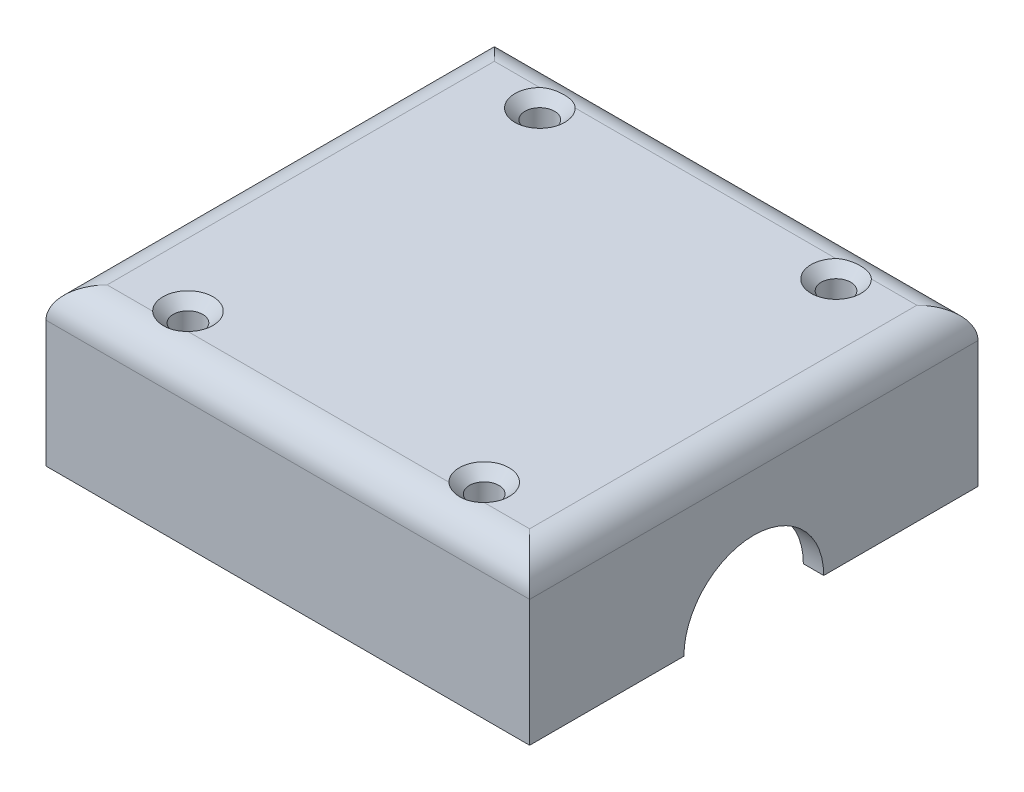
ISO-10303-21;
HEADER;
FILE_DESCRIPTION(('STEP AP214'),'2;1');
FILE_NAME('part.step','',(''),(''),'','','');
FILE_SCHEMA(('AUTOMOTIVE_DESIGN { 1 0 10303 214 1 1 1 1 }'));
ENDSEC;
DATA;
#1=APPLICATION_CONTEXT('core data for automotive mechanical design processes');
#2=APPLICATION_PROTOCOL_DEFINITION('international standard','automotive_design',2000,#1);
#3=PRODUCT_CONTEXT('',#1,'mechanical');
#4=PRODUCT('Part','Part','',(#3));
#5=PRODUCT_RELATED_PRODUCT_CATEGORY('part','',(#4));
#6=PRODUCT_DEFINITION_FORMATION('','',#4);
#7=PRODUCT_DEFINITION_CONTEXT('part definition',#1,'design');
#8=PRODUCT_DEFINITION('design','',#6,#7);
#9=PRODUCT_DEFINITION_SHAPE('','',#8);
#10=(LENGTH_UNIT() NAMED_UNIT(*) SI_UNIT(.MILLI.,.METRE.));
#11=(NAMED_UNIT(*) PLANE_ANGLE_UNIT() SI_UNIT($,.RADIAN.));
#12=(NAMED_UNIT(*) SI_UNIT($,.STERADIAN.) SOLID_ANGLE_UNIT());
#13=UNCERTAINTY_MEASURE_WITH_UNIT(LENGTH_MEASURE(1.E-05),#10,'distance_accuracy_value','');
#14=(GEOMETRIC_REPRESENTATION_CONTEXT(3) GLOBAL_UNCERTAINTY_ASSIGNED_CONTEXT((#13)) GLOBAL_UNIT_ASSIGNED_CONTEXT((#10,
#11,#12)) REPRESENTATION_CONTEXT('',''));
#15=CARTESIAN_POINT('',(0.,0.,0.));
#16=DIRECTION('',(0.,0.,1.));
#17=DIRECTION('',(1.,0.,0.));
#18=AXIS2_PLACEMENT_3D('',#15,#16,#17);
#19=CARTESIAN_POINT('',(0.129999999999996,7.65,-10.1));
#20=DIRECTION('',(0.,0.,-1.));
#21=DIRECTION('',(-1.,0.,0.));
#22=AXIS2_PLACEMENT_3D('',#19,#20,#21);
#23=PLANE('',#22);
#24=DIRECTION('',(-1.,0.,0.));
#25=VECTOR('',#24,1.);
#26=CARTESIAN_POINT('',(0.129999999999998,1.99705277911944,-10.1));
#27=LINE('',#26,#25);
#28=CARTESIAN_POINT('',(0.129999999999996,1.99705277911943,-10.1));
#29=VERTEX_POINT('',#28);
#30=CARTESIAN_POINT('',(-23.73,1.99705277911943,-10.1));
#31=VERTEX_POINT('',#30);
#32=EDGE_CURVE('E51',#29,#31,#27,.T.);
#33=ORIENTED_EDGE('',*,*,#32,.T.);
#34=DIRECTION('',(0.,-1.,0.));
#35=VECTOR('',#34,1.);
#36=CARTESIAN_POINT('',(-23.73,7.65,-10.1));
#37=LINE('',#36,#35);
#38=CARTESIAN_POINT('',(-23.73,0.,-10.1));
#39=VERTEX_POINT('',#38);
#40=EDGE_CURVE('E233',#31,#39,#37,.T.);
#41=ORIENTED_EDGE('',*,*,#40,.T.);
#42=DIRECTION('',(1.,0.,0.));
#43=VECTOR('',#42,1.);
#44=CARTESIAN_POINT('',(0.129999999999996,0.,-10.1));
#45=LINE('',#44,#43);
#46=CARTESIAN_POINT('',(0.129999999999996,0.,-10.1));
#47=VERTEX_POINT('',#46);
#48=EDGE_CURVE('E229',#39,#47,#45,.T.);
#49=ORIENTED_EDGE('',*,*,#48,.T.);
#50=DIRECTION('',(0.,-1.,0.));
#51=VECTOR('',#50,1.);
#52=CARTESIAN_POINT('',(0.129999999999996,7.65,-10.1));
#53=LINE('',#52,#51);
#54=EDGE_CURVE('E56',#29,#47,#53,.T.);
#55=ORIENTED_EDGE('',*,*,#54,.F.);
#56=EDGE_LOOP('',(#33,#41,#49,#55));
#57=FACE_BOUND('',#56,.T.);
#58=ADVANCED_FACE('F35',(#57),#23,.F.);
#59=CARTESIAN_POINT('',(0.,7.65,0.));
#60=DIRECTION('',(0.,-1.,0.));
#61=DIRECTION('',(0.,0.,-1.));
#62=AXIS2_PLACEMENT_3D('',#59,#60,#61);
#63=PLANE('',#62);
#64=DIRECTION('',(0.,0.,-1.));
#65=VECTOR('',#64,1.);
#66=CARTESIAN_POINT('',(-23.73,7.65,-10.1));
#67=LINE('',#66,#65);
#68=CARTESIAN_POINT('',(-23.73,7.65,7.65));
#69=VERTEX_POINT('',#68);
#70=CARTESIAN_POINT('',(-23.73,7.65,-7.65));
#71=VERTEX_POINT('',#70);
#72=EDGE_CURVE('E178',#69,#71,#67,.T.);
#73=ORIENTED_EDGE('',*,*,#72,.T.);
#74=DIRECTION('',(-1.,0.,0.));
#75=VECTOR('',#74,1.);
#76=CARTESIAN_POINT('',(0.129999999999998,7.65,-7.65));
#77=LINE('',#76,#75);
#78=CARTESIAN_POINT('',(0.129999999999996,7.65,-7.65));
#79=VERTEX_POINT('',#78);
#80=EDGE_CURVE('E487',#79,#71,#77,.T.);
#81=ORIENTED_EDGE('',*,*,#80,.F.);
#82=DIRECTION('',(0.,0.,1.));
#83=VECTOR('',#82,1.);
#84=CARTESIAN_POINT('',(0.129999999999996,7.65,-10.1));
#85=LINE('',#84,#83);
#86=CARTESIAN_POINT('',(0.129999999999996,7.65,7.65));
#87=VERTEX_POINT('',#86);
#88=EDGE_CURVE('E187',#79,#87,#85,.T.);
#89=ORIENTED_EDGE('',*,*,#88,.T.);
#90=DIRECTION('',(-1.,0.,0.));
#91=VECTOR('',#90,1.);
#92=CARTESIAN_POINT('',(0.129999999999998,7.65,7.65));
#93=LINE('',#92,#91);
#94=EDGE_CURVE('E191',#87,#69,#93,.T.);
#95=ORIENTED_EDGE('',*,*,#94,.T.);
#96=EDGE_LOOP('',(#73,#81,#89,#95));
#97=FACE_BOUND('',#96,.T.);
#98=ADVANCED_FACE('F192',(#97),#63,.T.);
#99=CARTESIAN_POINT('',(0.,0.,0.));
#100=DIRECTION('',(0.,1.,0.));
#101=DIRECTION('',(0.,0.,1.));
#102=AXIS2_PLACEMENT_3D('',#99,#100,#101);
#103=PLANE('',#102);
#104=CARTESIAN_POINT('',(14.535,0.,17.265));
#105=DIRECTION('',(0.,1.,0.));
#106=DIRECTION('',(0.,0.,1.));
#107=AXIS2_PLACEMENT_3D('',#104,#105,#106);
#108=CIRCLE('',#107,1.45);
#109=CARTESIAN_POINT('',(14.535,0.,18.715));
#110=VERTEX_POINT('',#109);
#111=EDGE_CURVE('E218',#110,#110,#108,.T.);
#112=ORIENTED_EDGE('',*,*,#111,.T.);
#113=EDGE_LOOP('',(#112));
#114=FACE_BOUND('',#113,.T.);
#115=CARTESIAN_POINT('',(-14.535,0.,17.265));
#116=DIRECTION('',(0.,1.,0.));
#117=DIRECTION('',(0.,0.,1.));
#118=AXIS2_PLACEMENT_3D('',#115,#116,#117);
#119=CIRCLE('',#118,1.45);
#120=CARTESIAN_POINT('',(-14.535,0.,18.715));
#121=VERTEX_POINT('',#120);
#122=EDGE_CURVE('E222',#121,#121,#119,.F.);
#123=ORIENTED_EDGE('',*,*,#122,.F.);
#124=EDGE_LOOP('',(#123));
#125=FACE_BOUND('',#124,.T.);
#126=DIRECTION('',(0.,0.,1.));
#127=VECTOR('',#126,1.);
#128=CARTESIAN_POINT('',(21.73,0.,0.));
#129=LINE('',#128,#127);
#130=CARTESIAN_POINT('',(21.73,0.,6.86000000000001));
#131=VERTEX_POINT('',#130);
#132=CARTESIAN_POINT('',(21.73,0.,10.91));
#133=VERTEX_POINT('',#132);
#134=EDGE_CURVE('E254',#131,#133,#129,.T.);
#135=ORIENTED_EDGE('',*,*,#134,.F.);
#136=DIRECTION('',(1.,0.,0.));
#137=VECTOR('',#136,1.);
#138=CARTESIAN_POINT('',(21.55,0.,6.86000000000001));
#139=LINE('',#138,#137);
#140=CARTESIAN_POINT('',(23.73,0.,6.86000000000001));
#141=VERTEX_POINT('',#140);
#142=EDGE_CURVE('E214',#131,#141,#139,.T.);
#143=ORIENTED_EDGE('',*,*,#142,.T.);
#144=DIRECTION('',(0.,0.,-1.));
#145=VECTOR('',#144,1.);
#146=CARTESIAN_POINT('',(23.73,0.,0.));
#147=LINE('',#146,#145);
#148=CARTESIAN_POINT('',(23.73,0.,22.));
#149=VERTEX_POINT('',#148);
#150=EDGE_CURVE('E262',#149,#141,#147,.T.);
#151=ORIENTED_EDGE('',*,*,#150,.F.);
#152=DIRECTION('',(1.,0.,0.));
#153=VECTOR('',#152,1.);
#154=CARTESIAN_POINT('',(0.,0.,22.));
#155=LINE('',#154,#153);
#156=CARTESIAN_POINT('',(-23.73,0.,22.));
#157=VERTEX_POINT('',#156);
#158=EDGE_CURVE('E258',#157,#149,#155,.T.);
#159=ORIENTED_EDGE('',*,*,#158,.F.);
#160=DIRECTION('',(0.,0.,-1.));
#161=VECTOR('',#160,1.);
#162=CARTESIAN_POINT('',(-23.73,0.,0.));
#163=LINE('',#162,#161);
#164=CARTESIAN_POINT('',(-23.73,0.,10.1));
#165=VERTEX_POINT('',#164);
#166=EDGE_CURVE('E269',#157,#165,#163,.T.);
#167=ORIENTED_EDGE('',*,*,#166,.T.);
#168=DIRECTION('',(-1.,0.,0.));
#169=VECTOR('',#168,1.);
#170=CARTESIAN_POINT('',(0.129999999999996,0.,10.1));
#171=LINE('',#170,#169);
#172=CARTESIAN_POINT('',(0.129999999999996,0.,10.1));
#173=VERTEX_POINT('',#172);
#174=EDGE_CURVE('E188',#173,#165,#171,.T.);
#175=ORIENTED_EDGE('',*,*,#174,.F.);
#176=DIRECTION('',(0.,0.,1.));
#177=VECTOR('',#176,1.);
#178=CARTESIAN_POINT('',(0.129999999999996,0.,0.));
#179=LINE('',#178,#177);
#180=CARTESIAN_POINT('',(0.129999999999996,0.,10.91));
#181=VERTEX_POINT('',#180);
#182=EDGE_CURVE('E247',#173,#181,#179,.T.);
#183=ORIENTED_EDGE('',*,*,#182,.T.);
#184=DIRECTION('',(1.,0.,0.));
#185=VECTOR('',#184,1.);
#186=CARTESIAN_POINT('',(0.,0.,10.91));
#187=LINE('',#186,#185);
#188=EDGE_CURVE('E244',#181,#133,#187,.T.);
#189=ORIENTED_EDGE('',*,*,#188,.T.);
#190=EDGE_LOOP('',(#135,#143,#151,#159,#167,#175,#183,#189));
#191=FACE_BOUND('',#190,.T.);
#192=ADVANCED_FACE('F378',(#114,#125,#191),#103,.F.);
#193=CARTESIAN_POINT('',(23.73,0.,-6.85999999999999));
#194=VERTEX_POINT('',#193);
#195=CARTESIAN_POINT('',(23.73,0.,-22.));
#196=VERTEX_POINT('',#195);
#197=EDGE_CURVE('E261',#194,#196,#147,.T.);
#198=ORIENTED_EDGE('',*,*,#197,.F.);
#199=DIRECTION('',(1.,0.,0.));
#200=VECTOR('',#199,1.);
#201=CARTESIAN_POINT('',(21.55,0.,-6.85999999999999));
#202=LINE('',#201,#200);
#203=CARTESIAN_POINT('',(21.73,0.,-6.85999999999999));
#204=VERTEX_POINT('',#203);
#205=EDGE_CURVE('E211',#194,#204,#202,.F.);
#206=ORIENTED_EDGE('',*,*,#205,.T.);
#207=CARTESIAN_POINT('',(21.73,0.,-10.91));
#208=VERTEX_POINT('',#207);
#209=EDGE_CURVE('E255',#208,#204,#129,.T.);
#210=ORIENTED_EDGE('',*,*,#209,.F.);
#211=DIRECTION('',(1.,0.,0.));
#212=VECTOR('',#211,1.);
#213=CARTESIAN_POINT('',(0.,0.,-10.91));
#214=LINE('',#213,#212);
#215=CARTESIAN_POINT('',(0.129999999999996,0.,-10.91));
#216=VERTEX_POINT('',#215);
#217=EDGE_CURVE('E251',#216,#208,#214,.T.);
#218=ORIENTED_EDGE('',*,*,#217,.F.);
#219=EDGE_CURVE('E248',#216,#47,#179,.T.);
#220=ORIENTED_EDGE('',*,*,#219,.T.);
#221=ORIENTED_EDGE('',*,*,#48,.F.);
#222=CARTESIAN_POINT('',(-23.73,0.,-22.));
#223=VERTEX_POINT('',#222);
#224=EDGE_CURVE('E268',#39,#223,#163,.T.);
#225=ORIENTED_EDGE('',*,*,#224,.T.);
#226=DIRECTION('',(1.,0.,0.));
#227=VECTOR('',#226,1.);
#228=CARTESIAN_POINT('',(0.,0.,-22.));
#229=LINE('',#228,#227);
#230=EDGE_CURVE('E265',#223,#196,#229,.T.);
#231=ORIENTED_EDGE('',*,*,#230,.T.);
#232=EDGE_LOOP('',(#198,#206,#210,#218,#220,#221,#225,#231));
#233=FACE_BOUND('',#232,.T.);
#234=CARTESIAN_POINT('',(-14.535,0.,-17.265));
#235=DIRECTION('',(0.,-1.,0.));
#236=DIRECTION('',(0.,0.,-1.));
#237=AXIS2_PLACEMENT_3D('',#234,#235,#236);
#238=CIRCLE('',#237,1.45);
#239=CARTESIAN_POINT('',(-14.535,0.,-18.715));
#240=VERTEX_POINT('',#239);
#241=EDGE_CURVE('E221',#240,#240,#238,.F.);
#242=ORIENTED_EDGE('',*,*,#241,.T.);
#243=EDGE_LOOP('',(#242));
#244=FACE_BOUND('',#243,.T.);
#245=CARTESIAN_POINT('',(14.535,0.,-17.265));
#246=DIRECTION('',(0.,-1.,0.));
#247=DIRECTION('',(0.,0.,-1.));
#248=AXIS2_PLACEMENT_3D('',#245,#246,#247);
#249=CIRCLE('',#248,1.45);
#250=CARTESIAN_POINT('',(14.535,0.,-18.715));
#251=VERTEX_POINT('',#250);
#252=EDGE_CURVE('E226',#251,#251,#249,.T.);
#253=ORIENTED_EDGE('',*,*,#252,.F.);
#254=EDGE_LOOP('',(#253));
#255=FACE_BOUND('',#254,.T.);
#256=ADVANCED_FACE('F396',(#233,#244,#255),#103,.F.);
#257=CARTESIAN_POINT('',(0.,15.4,0.));
#258=DIRECTION('',(0.,1.,0.));
#259=DIRECTION('',(0.,0.,1.));
#260=AXIS2_PLACEMENT_3D('',#257,#258,#259);
#261=PLANE('',#260);
#262=CARTESIAN_POINT('',(14.535,15.4,-17.265));
#263=DIRECTION('',(0.,1.,0.));
#264=DIRECTION('',(0.,0.,1.));
#265=AXIS2_PLACEMENT_3D('',#262,#263,#264);
#266=CIRCLE('',#265,2.45000000000001);
#267=CARTESIAN_POINT('',(16.2648193547304,15.4,-19.));
#268=VERTEX_POINT('',#267);
#269=CARTESIAN_POINT('',(12.8051806452696,15.4,-19.));
#270=VERTEX_POINT('',#269);
#271=EDGE_CURVE('E294',#268,#270,#266,.F.);
#272=ORIENTED_EDGE('',*,*,#271,.T.);
#273=DIRECTION('',(1.,0.,0.));
#274=VECTOR('',#273,1.);
#275=CARTESIAN_POINT('',(0.,15.4,-19.));
#276=LINE('',#275,#274);
#277=CARTESIAN_POINT('',(-12.8051806452696,15.4,-19.));
#278=VERTEX_POINT('',#277);
#279=EDGE_CURVE('E333',#270,#278,#276,.F.);
#280=ORIENTED_EDGE('',*,*,#279,.T.);
#281=CARTESIAN_POINT('',(-14.535,15.4,-17.265));
#282=DIRECTION('',(0.,1.,0.));
#283=DIRECTION('',(0.,0.,1.));
#284=AXIS2_PLACEMENT_3D('',#281,#282,#283);
#285=CIRCLE('',#284,2.44999999999999);
#286=CARTESIAN_POINT('',(-16.2648193547304,15.4,-19.));
#287=VERTEX_POINT('',#286);
#288=EDGE_CURVE('E289',#278,#287,#285,.F.);
#289=ORIENTED_EDGE('',*,*,#288,.T.);
#290=DIRECTION('',(1.,0.,0.));
#291=VECTOR('',#290,1.);
#292=CARTESIAN_POINT('',(0.,15.4,-19.));
#293=LINE('',#292,#291);
#294=CARTESIAN_POINT('',(-20.73,15.4,-19.));
#295=VERTEX_POINT('',#294);
#296=EDGE_CURVE('E331',#287,#295,#293,.F.);
#297=ORIENTED_EDGE('',*,*,#296,.T.);
#298=DIRECTION('',(0.,0.,-1.));
#299=VECTOR('',#298,1.);
#300=CARTESIAN_POINT('',(-20.73,15.4,0.));
#301=LINE('',#300,#299);
#302=CARTESIAN_POINT('',(-20.73,15.4,19.));
#303=VERTEX_POINT('',#302);
#304=EDGE_CURVE('E329',#295,#303,#301,.F.);
#305=ORIENTED_EDGE('',*,*,#304,.T.);
#306=DIRECTION('',(1.,0.,0.));
#307=VECTOR('',#306,1.);
#308=CARTESIAN_POINT('',(23.73,15.4,19.));
#309=LINE('',#308,#307);
#310=CARTESIAN_POINT('',(-16.2648193547304,15.4,19.));
#311=VERTEX_POINT('',#310);
#312=EDGE_CURVE('E327',#303,#311,#309,.T.);
#313=ORIENTED_EDGE('',*,*,#312,.T.);
#314=CARTESIAN_POINT('',(-14.535,15.4,17.265));
#315=DIRECTION('',(0.,1.,0.));
#316=DIRECTION('',(0.,0.,1.));
#317=AXIS2_PLACEMENT_3D('',#314,#315,#316);
#318=CIRCLE('',#317,2.45000000000001);
#319=CARTESIAN_POINT('',(-12.8051806452696,15.4,19.));
#320=VERTEX_POINT('',#319);
#321=EDGE_CURVE('E297',#311,#320,#318,.F.);
#322=ORIENTED_EDGE('',*,*,#321,.T.);
#323=DIRECTION('',(1.,0.,0.));
#324=VECTOR('',#323,1.);
#325=CARTESIAN_POINT('',(23.73,15.4,19.));
#326=LINE('',#325,#324);
#327=CARTESIAN_POINT('',(12.8051806452696,15.4,19.));
#328=VERTEX_POINT('',#327);
#329=EDGE_CURVE('E325',#320,#328,#326,.T.);
#330=ORIENTED_EDGE('',*,*,#329,.T.);
#331=CARTESIAN_POINT('',(14.535,15.4,17.265));
#332=DIRECTION('',(0.,1.,0.));
#333=DIRECTION('',(0.,0.,1.));
#334=AXIS2_PLACEMENT_3D('',#331,#332,#333);
#335=CIRCLE('',#334,2.45000000000001);
#336=CARTESIAN_POINT('',(16.2648193547304,15.4,19.));
#337=VERTEX_POINT('',#336);
#338=EDGE_CURVE('E300',#328,#337,#335,.F.);
#339=ORIENTED_EDGE('',*,*,#338,.T.);
#340=DIRECTION('',(1.,0.,0.));
#341=VECTOR('',#340,1.);
#342=CARTESIAN_POINT('',(23.73,15.4,19.));
#343=LINE('',#342,#341);
#344=CARTESIAN_POINT('',(20.73,15.4,19.));
#345=VERTEX_POINT('',#344);
#346=EDGE_CURVE('E318',#337,#345,#343,.T.);
#347=ORIENTED_EDGE('',*,*,#346,.T.);
#348=DIRECTION('',(0.,0.,-1.));
#349=VECTOR('',#348,1.);
#350=CARTESIAN_POINT('',(20.73,15.4,-22.));
#351=LINE('',#350,#349);
#352=CARTESIAN_POINT('',(20.73,15.4,-19.));
#353=VERTEX_POINT('',#352);
#354=EDGE_CURVE('E320',#345,#353,#351,.T.);
#355=ORIENTED_EDGE('',*,*,#354,.T.);
#356=DIRECTION('',(1.,0.,0.));
#357=VECTOR('',#356,1.);
#358=CARTESIAN_POINT('',(0.,15.4,-19.));
#359=LINE('',#358,#357);
#360=EDGE_CURVE('E322',#353,#268,#359,.F.);
#361=ORIENTED_EDGE('',*,*,#360,.T.);
#362=EDGE_LOOP('',(#272,#280,#289,#297,#305,#313,#322,#330,#339,#347,#355,#361));
#363=FACE_BOUND('',#362,.T.);
#364=ADVANCED_FACE('F392',(#363),#261,.T.);
#365=CARTESIAN_POINT('',(0.,15.4,22.));
#366=DIRECTION('',(0.,0.,-1.));
#367=DIRECTION('',(-1.,0.,0.));
#368=AXIS2_PLACEMENT_3D('',#365,#366,#367);
#369=PLANE('',#368);
#370=DIRECTION('',(0.,-1.,0.));
#371=VECTOR('',#370,1.);
#372=CARTESIAN_POINT('',(23.73,15.4,22.));
#373=LINE('',#372,#371);
#374=CARTESIAN_POINT('',(23.73,12.4,22.));
#375=VERTEX_POINT('',#374);
#376=EDGE_CURVE('E279',#375,#149,#373,.T.);
#377=ORIENTED_EDGE('',*,*,#376,.F.);
#378=DIRECTION('',(1.,0.,0.));
#379=VECTOR('',#378,1.);
#380=CARTESIAN_POINT('',(-23.73,12.4,22.));
#381=LINE('',#380,#379);
#382=CARTESIAN_POINT('',(-23.73,12.4,22.));
#383=VERTEX_POINT('',#382);
#384=EDGE_CURVE('E44',#375,#383,#381,.F.);
#385=ORIENTED_EDGE('',*,*,#384,.T.);
#386=DIRECTION('',(0.,-1.,0.));
#387=VECTOR('',#386,1.);
#388=CARTESIAN_POINT('',(-23.73,15.4,22.));
#389=LINE('',#388,#387);
#390=EDGE_CURVE('E272',#383,#157,#389,.T.);
#391=ORIENTED_EDGE('',*,*,#390,.T.);
#392=ORIENTED_EDGE('',*,*,#158,.T.);
#393=EDGE_LOOP('',(#377,#385,#391,#392));
#394=FACE_BOUND('',#393,.T.);
#395=ADVANCED_FACE('F395',(#394),#369,.F.);
#396=CARTESIAN_POINT('',(23.73,15.4,0.));
#397=DIRECTION('',(-1.,0.,0.));
#398=DIRECTION('',(0.,0.,1.));
#399=AXIS2_PLACEMENT_3D('',#396,#397,#398);
#400=PLANE('',#399);
#401=ORIENTED_EDGE('',*,*,#150,.T.);
#402=CARTESIAN_POINT('',(23.73,0.,0.));
#403=DIRECTION('',(1.,0.,0.));
#404=DIRECTION('',(0.,0.,-1.));
#405=AXIS2_PLACEMENT_3D('',#402,#403,#404);
#406=CIRCLE('',#405,6.86);
#407=EDGE_CURVE('E208',#194,#141,#406,.T.);
#408=ORIENTED_EDGE('',*,*,#407,.F.);
#409=ORIENTED_EDGE('',*,*,#197,.T.);
#410=DIRECTION('',(0.,-1.,0.));
#411=VECTOR('',#410,1.);
#412=CARTESIAN_POINT('',(23.73,15.4,-22.));
#413=LINE('',#412,#411);
#414=CARTESIAN_POINT('',(23.73,12.4,-22.));
#415=VERTEX_POINT('',#414);
#416=EDGE_CURVE('E276',#415,#196,#413,.T.);
#417=ORIENTED_EDGE('',*,*,#416,.F.);
#418=DIRECTION('',(0.,0.,-1.));
#419=VECTOR('',#418,1.);
#420=CARTESIAN_POINT('',(23.73,12.4,22.));
#421=LINE('',#420,#419);
#422=EDGE_CURVE('E462',#415,#375,#421,.F.);
#423=ORIENTED_EDGE('',*,*,#422,.T.);
#424=ORIENTED_EDGE('',*,*,#376,.T.);
#425=EDGE_LOOP('',(#401,#408,#409,#417,#423,#424));
#426=FACE_BOUND('',#425,.T.);
#427=ADVANCED_FACE('F406',(#426),#400,.F.);
#428=CARTESIAN_POINT('',(0.,15.4,-22.));
#429=DIRECTION('',(0.,0.,-1.));
#430=DIRECTION('',(-1.,0.,0.));
#431=AXIS2_PLACEMENT_3D('',#428,#429,#430);
#432=PLANE('',#431);
#433=DIRECTION('',(0.,-1.,0.));
#434=VECTOR('',#433,1.);
#435=CARTESIAN_POINT('',(-23.73,15.4,-22.));
#436=LINE('',#435,#434);
#437=CARTESIAN_POINT('',(-23.73,12.4,-22.));
#438=VERTEX_POINT('',#437);
#439=EDGE_CURVE('E274',#438,#223,#436,.T.);
#440=ORIENTED_EDGE('',*,*,#439,.F.);
#441=DIRECTION('',(1.,0.,0.));
#442=VECTOR('',#441,1.);
#443=CARTESIAN_POINT('',(0.,12.4,-22.));
#444=LINE('',#443,#442);
#445=EDGE_CURVE('E315',#438,#415,#444,.T.);
#446=ORIENTED_EDGE('',*,*,#445,.T.);
#447=ORIENTED_EDGE('',*,*,#416,.T.);
#448=ORIENTED_EDGE('',*,*,#230,.F.);
#449=EDGE_LOOP('',(#440,#446,#447,#448));
#450=FACE_BOUND('',#449,.T.);
#451=ADVANCED_FACE('F403',(#450),#432,.T.);
#452=CARTESIAN_POINT('',(-23.73,15.4,0.));
#453=DIRECTION('',(-1.,0.,0.));
#454=DIRECTION('',(0.,0.,1.));
#455=AXIS2_PLACEMENT_3D('',#452,#453,#454);
#456=PLANE('',#455);
#457=ORIENTED_EDGE('',*,*,#40,.F.);
#458=CARTESIAN_POINT('',(-23.73,0.998526389559721,-0.0494803592374984));
#459=DIRECTION('',(-1.,0.,0.));
#460=DIRECTION('',(0.,0.,1.));
#461=AXIS2_PLACEMENT_3D('',#458,#459,#460);
#462=CIRCLE('',#461,10.1);
#463=EDGE_CURVE('E184',#71,#31,#462,.T.);
#464=ORIENTED_EDGE('',*,*,#463,.F.);
#465=ORIENTED_EDGE('',*,*,#72,.F.);
#466=CARTESIAN_POINT('',(-23.73,0.998526389559721,0.0494803592374984));
#467=DIRECTION('',(-1.,0.,0.));
#468=DIRECTION('',(0.,0.,1.));
#469=AXIS2_PLACEMENT_3D('',#466,#467,#468);
#470=CIRCLE('',#469,10.1);
#471=CARTESIAN_POINT('',(-23.73,1.99705277911946,10.1));
#472=VERTEX_POINT('',#471);
#473=EDGE_CURVE('E182',#69,#472,#470,.F.);
#474=ORIENTED_EDGE('',*,*,#473,.T.);
#475=DIRECTION('',(0.,-1.,0.));
#476=VECTOR('',#475,1.);
#477=CARTESIAN_POINT('',(-23.73,7.65,10.1));
#478=LINE('',#477,#476);
#479=EDGE_CURVE('E237',#472,#165,#478,.T.);
#480=ORIENTED_EDGE('',*,*,#479,.T.);
#481=ORIENTED_EDGE('',*,*,#166,.F.);
#482=ORIENTED_EDGE('',*,*,#390,.F.);
#483=DIRECTION('',(0.,0.,-1.));
#484=VECTOR('',#483,1.);
#485=CARTESIAN_POINT('',(-23.73,12.4,0.));
#486=LINE('',#485,#484);
#487=EDGE_CURVE('E453',#383,#438,#486,.T.);
#488=ORIENTED_EDGE('',*,*,#487,.T.);
#489=ORIENTED_EDGE('',*,*,#439,.T.);
#490=ORIENTED_EDGE('',*,*,#224,.F.);
#491=EDGE_LOOP('',(#457,#464,#465,#474,#480,#481,#482,#488,#489,#490));
#492=FACE_BOUND('',#491,.T.);
#493=ADVANCED_FACE('F180',(#492),#456,.T.);
#494=CARTESIAN_POINT('',(21.73,10.91,0.));
#495=DIRECTION('',(1.,0.,0.));
#496=DIRECTION('',(0.,0.,-1.));
#497=AXIS2_PLACEMENT_3D('',#494,#495,#496);
#498=PLANE('',#497);
#499=ORIENTED_EDGE('',*,*,#209,.T.);
#500=CARTESIAN_POINT('',(21.73,0.,0.));
#501=DIRECTION('',(1.,0.,0.));
#502=DIRECTION('',(0.,0.,-1.));
#503=AXIS2_PLACEMENT_3D('',#500,#501,#502);
#504=CIRCLE('',#503,6.86);
#505=EDGE_CURVE('E11',#204,#131,#504,.T.);
#506=ORIENTED_EDGE('',*,*,#505,.T.);
#507=ORIENTED_EDGE('',*,*,#134,.T.);
#508=CARTESIAN_POINT('',(21.73,0.,0.));
#509=DIRECTION('',(1.,0.,0.));
#510=DIRECTION('',(0.,0.,-1.));
#511=AXIS2_PLACEMENT_3D('',#508,#509,#510);
#512=CIRCLE('',#511,10.91);
#513=CARTESIAN_POINT('',(21.73,10.91,0.));
#514=VERTEX_POINT('',#513);
#515=EDGE_CURVE('E281',#133,#514,#512,.F.);
#516=ORIENTED_EDGE('',*,*,#515,.T.);
#517=CARTESIAN_POINT('',(21.73,0.,0.));
#518=DIRECTION('',(1.,0.,0.));
#519=DIRECTION('',(0.,0.,-1.));
#520=AXIS2_PLACEMENT_3D('',#517,#518,#519);
#521=CIRCLE('',#520,10.91);
#522=EDGE_CURVE('E283',#514,#208,#521,.F.);
#523=ORIENTED_EDGE('',*,*,#522,.T.);
#524=EDGE_LOOP('',(#499,#506,#507,#516,#523));
#525=FACE_BOUND('',#524,.T.);
#526=ADVANCED_FACE('F383',(#525),#498,.F.);
#527=CARTESIAN_POINT('',(0.129999999999996,10.91,0.));
#528=DIRECTION('',(1.,0.,0.));
#529=DIRECTION('',(0.,0.,-1.));
#530=AXIS2_PLACEMENT_3D('',#527,#528,#529);
#531=PLANE('',#530);
#532=CARTESIAN_POINT('',(0.129999999999996,0.,0.));
#533=DIRECTION('',(1.,0.,0.));
#534=DIRECTION('',(0.,0.,-1.));
#535=AXIS2_PLACEMENT_3D('',#532,#533,#534);
#536=CIRCLE('',#535,10.91);
#537=CARTESIAN_POINT('',(0.129999999999996,10.91,0.));
#538=VERTEX_POINT('',#537);
#539=EDGE_CURVE('E287',#216,#538,#536,.T.);
#540=ORIENTED_EDGE('',*,*,#539,.T.);
#541=CARTESIAN_POINT('',(0.129999999999996,0.,0.));
#542=DIRECTION('',(1.,0.,0.));
#543=DIRECTION('',(0.,0.,-1.));
#544=AXIS2_PLACEMENT_3D('',#541,#542,#543);
#545=CIRCLE('',#544,10.91);
#546=EDGE_CURVE('E285',#538,#181,#545,.T.);
#547=ORIENTED_EDGE('',*,*,#546,.T.);
#548=ORIENTED_EDGE('',*,*,#182,.F.);
#549=DIRECTION('',(0.,-1.,0.));
#550=VECTOR('',#549,1.);
#551=CARTESIAN_POINT('',(0.129999999999996,7.65,10.1));
#552=LINE('',#551,#550);
#553=CARTESIAN_POINT('',(0.129999999999996,1.99705277911946,10.1));
#554=VERTEX_POINT('',#553);
#555=EDGE_CURVE('E240',#554,#173,#552,.T.);
#556=ORIENTED_EDGE('',*,*,#555,.F.);
#557=CARTESIAN_POINT('',(0.129999999999998,0.998526389559721,0.0494803592374984));
#558=DIRECTION('',(-1.,0.,0.));
#559=DIRECTION('',(0.,0.,1.));
#560=AXIS2_PLACEMENT_3D('',#557,#558,#559);
#561=CIRCLE('',#560,10.1);
#562=EDGE_CURVE('E198',#87,#554,#561,.F.);
#563=ORIENTED_EDGE('',*,*,#562,.F.);
#564=ORIENTED_EDGE('',*,*,#88,.F.);
#565=CARTESIAN_POINT('',(0.129999999999998,0.998526389559721,-0.0494803592374984));
#566=DIRECTION('',(-1.,0.,0.));
#567=DIRECTION('',(0.,0.,1.));
#568=AXIS2_PLACEMENT_3D('',#565,#566,#567);
#569=CIRCLE('',#568,10.1);
#570=EDGE_CURVE('E204',#79,#29,#569,.T.);
#571=ORIENTED_EDGE('',*,*,#570,.T.);
#572=ORIENTED_EDGE('',*,*,#54,.T.);
#573=ORIENTED_EDGE('',*,*,#219,.F.);
#574=EDGE_LOOP('',(#540,#547,#548,#556,#563,#564,#571,#572,#573));
#575=FACE_BOUND('',#574,.T.);
#576=ADVANCED_FACE('F386',(#575),#531,.T.);
#577=CARTESIAN_POINT('',(0.,0.,0.));
#578=DIRECTION('',(-1.,0.,0.));
#579=DIRECTION('',(0.,0.,1.));
#580=AXIS2_PLACEMENT_3D('',#577,#578,#579);
#581=CYLINDRICAL_SURFACE('',#580,10.91);
#582=ORIENTED_EDGE('',*,*,#188,.F.);
#583=ORIENTED_EDGE('',*,*,#546,.F.);
#584=DIRECTION('',(1.,0.,0.));
#585=VECTOR('',#584,1.);
#586=CARTESIAN_POINT('',(0.129999999999996,10.91,0.));
#587=LINE('',#586,#585);
#588=EDGE_CURVE('E239',#514,#538,#587,.F.);
#589=ORIENTED_EDGE('',*,*,#588,.F.);
#590=ORIENTED_EDGE('',*,*,#515,.F.);
#591=EDGE_LOOP('',(#582,#583,#589,#590));
#592=FACE_BOUND('',#591,.T.);
#593=ADVANCED_FACE('F390',(#592),#581,.F.);
#594=CARTESIAN_POINT('',(0.,0.,0.));
#595=DIRECTION('',(1.,0.,0.));
#596=DIRECTION('',(0.,0.,-1.));
#597=AXIS2_PLACEMENT_3D('',#594,#595,#596);
#598=CYLINDRICAL_SURFACE('',#597,10.91);
#599=ORIENTED_EDGE('',*,*,#539,.F.);
#600=ORIENTED_EDGE('',*,*,#217,.T.);
#601=ORIENTED_EDGE('',*,*,#522,.F.);
#602=ORIENTED_EDGE('',*,*,#588,.T.);
#603=EDGE_LOOP('',(#599,#600,#601,#602));
#604=FACE_BOUND('',#603,.T.);
#605=ADVANCED_FACE('F414',(#604),#598,.F.);
#606=CARTESIAN_POINT('',(0.129999999999996,7.65,10.1));
#607=DIRECTION('',(0.,0.,1.));
#608=DIRECTION('',(1.,0.,0.));
#609=AXIS2_PLACEMENT_3D('',#606,#607,#608);
#610=PLANE('',#609);
#611=ORIENTED_EDGE('',*,*,#479,.F.);
#612=DIRECTION('',(-1.,0.,0.));
#613=VECTOR('',#612,1.);
#614=CARTESIAN_POINT('',(0.129999999999998,1.99705277911946,10.1));
#615=LINE('',#614,#613);
#616=EDGE_CURVE('E197',#554,#472,#615,.T.);
#617=ORIENTED_EDGE('',*,*,#616,.F.);
#618=ORIENTED_EDGE('',*,*,#555,.T.);
#619=ORIENTED_EDGE('',*,*,#174,.T.);
#620=EDGE_LOOP('',(#611,#617,#618,#619));
#621=FACE_BOUND('',#620,.T.);
#622=ADVANCED_FACE('F382',(#621),#610,.F.);
#623=CARTESIAN_POINT('',(-14.535,20.18,-17.265));
#624=DIRECTION('',(0.,-1.,0.));
#625=DIRECTION('',(0.,0.,-1.));
#626=AXIS2_PLACEMENT_3D('',#623,#624,#625);
#627=CYLINDRICAL_SURFACE('',#626,1.45);
#628=CARTESIAN_POINT('',(-14.535,14.4,-17.265));
#629=DIRECTION('',(0.,1.,0.));
#630=DIRECTION('',(0.,0.,1.));
#631=AXIS2_PLACEMENT_3D('',#628,#629,#630);
#632=CIRCLE('',#631,1.45);
#633=CARTESIAN_POINT('',(-14.535,14.4,-15.815));
#634=VERTEX_POINT('',#633);
#635=EDGE_CURVE('E312',#634,#634,#632,.T.);
#636=ORIENTED_EDGE('',*,*,#635,.T.);
#637=EDGE_LOOP('',(#636));
#638=FACE_BOUND('',#637,.T.);
#639=ORIENTED_EDGE('',*,*,#241,.F.);
#640=EDGE_LOOP('',(#639));
#641=FACE_BOUND('',#640,.T.);
#642=ADVANCED_FACE('F526',(#638,#641),#627,.F.);
#643=CARTESIAN_POINT('',(14.535,20.18,-17.265));
#644=DIRECTION('',(0.,-1.,0.));
#645=DIRECTION('',(0.,0.,-1.));
#646=AXIS2_PLACEMENT_3D('',#643,#644,#645);
#647=CYLINDRICAL_SURFACE('',#646,1.45);
#648=CARTESIAN_POINT('',(14.535,14.4,-17.265));
#649=DIRECTION('',(0.,1.,0.));
#650=DIRECTION('',(0.,0.,1.));
#651=AXIS2_PLACEMENT_3D('',#648,#649,#650);
#652=CIRCLE('',#651,1.45);
#653=CARTESIAN_POINT('',(14.535,14.4,-15.815));
#654=VERTEX_POINT('',#653);
#655=EDGE_CURVE('E309',#654,#654,#652,.T.);
#656=ORIENTED_EDGE('',*,*,#655,.T.);
#657=EDGE_LOOP('',(#656));
#658=FACE_BOUND('',#657,.T.);
#659=ORIENTED_EDGE('',*,*,#252,.T.);
#660=EDGE_LOOP('',(#659));
#661=FACE_BOUND('',#660,.T.);
#662=ADVANCED_FACE('F522',(#658,#661),#647,.F.);
#663=CARTESIAN_POINT('',(-14.535,20.18,17.265));
#664=DIRECTION('',(0.,-1.,0.));
#665=DIRECTION('',(0.,0.,-1.));
#666=AXIS2_PLACEMENT_3D('',#663,#664,#665);
#667=CYLINDRICAL_SURFACE('',#666,1.45);
#668=CARTESIAN_POINT('',(-14.535,14.4,17.265));
#669=DIRECTION('',(0.,1.,0.));
#670=DIRECTION('',(0.,0.,1.));
#671=AXIS2_PLACEMENT_3D('',#668,#669,#670);
#672=CIRCLE('',#671,1.45);
#673=CARTESIAN_POINT('',(-14.535,14.4,18.715));
#674=VERTEX_POINT('',#673);
#675=EDGE_CURVE('E306',#674,#674,#672,.T.);
#676=ORIENTED_EDGE('',*,*,#675,.T.);
#677=EDGE_LOOP('',(#676));
#678=FACE_BOUND('',#677,.T.);
#679=ORIENTED_EDGE('',*,*,#122,.T.);
#680=EDGE_LOOP('',(#679));
#681=FACE_BOUND('',#680,.T.);
#682=ADVANCED_FACE('F518',(#678,#681),#667,.F.);
#683=CARTESIAN_POINT('',(14.535,20.18,17.265));
#684=DIRECTION('',(0.,-1.,0.));
#685=DIRECTION('',(0.,0.,-1.));
#686=AXIS2_PLACEMENT_3D('',#683,#684,#685);
#687=CYLINDRICAL_SURFACE('',#686,1.45);
#688=CARTESIAN_POINT('',(14.535,14.4,17.265));
#689=DIRECTION('',(0.,1.,0.));
#690=DIRECTION('',(0.,0.,1.));
#691=AXIS2_PLACEMENT_3D('',#688,#689,#690);
#692=CIRCLE('',#691,1.45);
#693=CARTESIAN_POINT('',(14.535,14.4,18.715));
#694=VERTEX_POINT('',#693);
#695=EDGE_CURVE('E303',#694,#694,#692,.T.);
#696=ORIENTED_EDGE('',*,*,#695,.T.);
#697=EDGE_LOOP('',(#696));
#698=FACE_BOUND('',#697,.T.);
#699=ORIENTED_EDGE('',*,*,#111,.F.);
#700=EDGE_LOOP('',(#699));
#701=FACE_BOUND('',#700,.T.);
#702=ADVANCED_FACE('F425',(#698,#701),#687,.F.);
#703=CARTESIAN_POINT('',(14.535,15.4,17.265));
#704=DIRECTION('',(0.,1.,0.));
#705=DIRECTION('',(0.,0.,1.));
#706=AXIS2_PLACEMENT_3D('',#703,#704,#705);
#707=CONICAL_SURFACE('',#706,2.45000000000001,0.785398163397447);
#708=ORIENTED_EDGE('',*,*,#695,.F.);
#709=EDGE_LOOP('',(#708));
#710=FACE_BOUND('',#709,.T.);
#711=ORIENTED_EDGE('',*,*,#338,.F.);
#712=CARTESIAN_POINT('',(12.8051806452696,15.4,19.));
#713=CARTESIAN_POINT('',(12.8487964449012,15.3999865592202,19.0434752853757));
#714=CARTESIAN_POINT('',(12.8946564562043,15.3990550056747,19.0845972451616));
#715=CARTESIAN_POINT('',(12.9900177358533,15.3958703553409,19.1621209097082));
#716=CARTESIAN_POINT('',(13.0395112303278,15.3936200119627,19.1985322566456));
#717=CARTESIAN_POINT('',(13.1411504415482,15.3883253224683,19.2665807527741));
#718=CARTESIAN_POINT('',(13.1932769453847,15.3852862030483,19.2982472422263));
#719=CARTESIAN_POINT('',(13.2999348480345,15.3788026512619,19.35722520691));
#720=CARTESIAN_POINT('',(13.3544678288942,15.3753579497025,19.3845337610519));
#721=CARTESIAN_POINT('',(13.5432403277821,15.3635592359694,19.4702200296656));
#722=CARTESIAN_POINT('',(13.6821492356707,15.3550860827933,19.5185479607088));
#723=CARTESIAN_POINT('',(13.9662469666682,15.3412008919374,19.592217447635));
#724=CARTESIAN_POINT('',(14.1114513924761,15.3357969901002,19.6174980167595));
#725=CARTESIAN_POINT('',(14.4057457104124,15.3296967109452,19.6458244537817));
#726=CARTESIAN_POINT('',(14.5548609124547,15.32905379034,19.6486178641338));
#727=CARTESIAN_POINT('',(14.8519529320195,15.3328319570247,19.6313413239755));
#728=CARTESIAN_POINT('',(14.9999282648567,15.3372587945921,19.6112454118235));
#729=CARTESIAN_POINT('',(15.2228285382605,15.3468547264256,19.5624199965464));
#730=CARTESIAN_POINT('',(15.299719790215,15.3507210152408,19.5420529559272));
#731=CARTESIAN_POINT('',(15.4513587063897,15.359080529551,19.4944052967245));
#732=CARTESIAN_POINT('',(15.5261055623792,15.3635739877813,19.4671221085581));
#733=CARTESIAN_POINT('',(15.6722457149023,15.3726218701794,19.4055626976896));
#734=CARTESIAN_POINT('',(15.743653368961,15.377175898868,19.3713206222981));
#735=CARTESIAN_POINT('',(15.8824554172032,15.385653085887,19.2955155633073));
#736=CARTESIAN_POINT('',(15.9498543073812,15.3895769596957,19.2539609963329));
#737=CARTESIAN_POINT('',(16.0591178585994,15.3949080629897,19.1774809871136));
#738=CARTESIAN_POINT('',(16.1023661880717,15.3967186037616,19.1445581349106));
#739=CARTESIAN_POINT('',(16.1859384753927,15.3992614292373,19.0750401626116));
#740=CARTESIAN_POINT('',(16.226257954575,15.3999920943284,19.0384396142744));
#741=CARTESIAN_POINT('',(16.2648193547304,15.4,19.));
#742=B_SPLINE_CURVE_WITH_KNOTS('',3,(#712,#713,#714,#715,#716,#717,#718,#719,#720,#721,#722,
#723,#724,#725,#726,#727,#728,#729,#730,#731,#732,#733,#734,#735,#736,#737,#738,#739,#740,#741),
.UNSPECIFIED.,.F.,.F.,(4,2,2,2,2,2,2,2,2,2,2,2,2,2,4),(0.,0.184551841592737,0.368719735990842,
0.551697116350696,0.734796634454802,1.17432355102798,1.61501017381738,2.06063746737229,
2.50677070629462,2.7454094717374,2.98413702983278,3.22172027053143,3.45903182221289,
3.62198598972215,3.78518431103786),.UNSPECIFIED.);
#743=EDGE_CURVE('E429',#328,#337,#742,.T.);
#744=ORIENTED_EDGE('',*,*,#743,.T.);
#745=EDGE_LOOP('',(#711,#744));
#746=FACE_BOUND('',#745,.T.);
#747=ADVANCED_FACE('F421',(#710,#746),#707,.F.);
#748=CARTESIAN_POINT('',(-14.535,14.4,17.265));
#749=DIRECTION('',(0.,1.,0.));
#750=DIRECTION('',(0.,0.,1.));
#751=AXIS2_PLACEMENT_3D('',#748,#749,#750);
#752=CONICAL_SURFACE('',#751,1.45,0.785398163397449);
#753=ORIENTED_EDGE('',*,*,#321,.F.);
#754=CARTESIAN_POINT('',(-16.2648193547304,15.4,19.));
#755=CARTESIAN_POINT('',(-16.2212035550988,15.3999865592202,19.0434752853757));
#756=CARTESIAN_POINT('',(-16.1753435437957,15.3990550056747,19.0845972451616));
#757=CARTESIAN_POINT('',(-16.0799822641467,15.3958703553409,19.1621209097082));
#758=CARTESIAN_POINT('',(-16.0304887696722,15.3936200119627,19.1985322566456));
#759=CARTESIAN_POINT('',(-15.9288495584518,15.3883253224683,19.2665807527741));
#760=CARTESIAN_POINT('',(-15.8767230546153,15.3852862030483,19.2982472422263));
#761=CARTESIAN_POINT('',(-15.7700651519655,15.3788026512619,19.35722520691));
#762=CARTESIAN_POINT('',(-15.7155321711058,15.3753579497025,19.3845337610519));
#763=CARTESIAN_POINT('',(-15.5267596722179,15.3635592359694,19.4702200296656));
#764=CARTESIAN_POINT('',(-15.3878507643293,15.3550860827933,19.5185479607088));
#765=CARTESIAN_POINT('',(-15.1037530333318,15.3412008919374,19.592217447635));
#766=CARTESIAN_POINT('',(-14.9585486075239,15.3357969901002,19.6174980167595));
#767=CARTESIAN_POINT('',(-14.6642542895876,15.3296967109452,19.6458244537817));
#768=CARTESIAN_POINT('',(-14.5151390875453,15.32905379034,19.6486178641338));
#769=CARTESIAN_POINT('',(-14.2180470679805,15.3328319570247,19.6313413239755));
#770=CARTESIAN_POINT('',(-14.0700717351433,15.3372587945921,19.6112454118235));
#771=CARTESIAN_POINT('',(-13.8471714617395,15.3468547264256,19.5624199965464));
#772=CARTESIAN_POINT('',(-13.7702802097849,15.3507210152408,19.5420529559272));
#773=CARTESIAN_POINT('',(-13.6186412936103,15.359080529551,19.4944052967245));
#774=CARTESIAN_POINT('',(-13.5438944376208,15.3635739877813,19.4671221085581));
#775=CARTESIAN_POINT('',(-13.3977542850977,15.3726218701794,19.4055626976895));
#776=CARTESIAN_POINT('',(-13.326346631039,15.377175898868,19.3713206222981));
#777=CARTESIAN_POINT('',(-13.1875445827968,15.385653085887,19.2955155633073));
#778=CARTESIAN_POINT('',(-13.1201456926188,15.3895769596957,19.2539609963328));
#779=CARTESIAN_POINT('',(-13.0108821414006,15.3949080629897,19.1774809871136));
#780=CARTESIAN_POINT('',(-12.9676338119283,15.3967186037616,19.1445581349106));
#781=CARTESIAN_POINT('',(-12.8840615246073,15.3992614292373,19.0750401626116));
#782=CARTESIAN_POINT('',(-12.8437420454249,15.3999920943284,19.0384396142744));
#783=CARTESIAN_POINT('',(-12.8051806452696,15.4,19.));
#784=B_SPLINE_CURVE_WITH_KNOTS('',3,(#754,#755,#756,#757,#758,#759,#760,#761,#762,#763,#764,
#765,#766,#767,#768,#769,#770,#771,#772,#773,#774,#775,#776,#777,#778,#779,#780,#781,#782,#783),
.UNSPECIFIED.,.F.,.F.,(4,2,2,2,2,2,2,2,2,2,2,2,2,2,4),(0.,0.184551841592737,0.368719735990844,
0.551697116350701,0.734796634454802,1.17432355102798,1.61501017381738,2.0606374673723,
2.50677070629463,2.74540947173741,2.98413702983279,3.22172027053143,3.45903182221289,
3.62198598972216,3.78518431103786),.UNSPECIFIED.);
#785=EDGE_CURVE('E436',#311,#320,#784,.T.);
#786=ORIENTED_EDGE('',*,*,#785,.T.);
#787=EDGE_LOOP('',(#753,#786));
#788=FACE_BOUND('',#787,.T.);
#789=ORIENTED_EDGE('',*,*,#675,.F.);
#790=EDGE_LOOP('',(#789));
#791=FACE_BOUND('',#790,.T.);
#792=ADVANCED_FACE('F424',(#788,#791),#752,.F.);
#793=CARTESIAN_POINT('',(14.535,14.4,-17.265));
#794=DIRECTION('',(0.,1.,0.));
#795=DIRECTION('',(0.,0.,1.));
#796=AXIS2_PLACEMENT_3D('',#793,#794,#795);
#797=CONICAL_SURFACE('',#796,1.45,0.785398163397449);
#798=ORIENTED_EDGE('',*,*,#271,.F.);
#799=CARTESIAN_POINT('',(16.2648193547304,15.4,-19.));
#800=CARTESIAN_POINT('',(16.2212035550988,15.3999865592202,-19.0434752853757));
#801=CARTESIAN_POINT('',(16.1753435437957,15.3990550056747,-19.0845972451616));
#802=CARTESIAN_POINT('',(16.0799822641467,15.3958703553409,-19.1621209097082));
#803=CARTESIAN_POINT('',(16.0304887696722,15.3936200119627,-19.1985322566456));
#804=CARTESIAN_POINT('',(15.9288495584518,15.3883253224683,-19.2665807527741));
#805=CARTESIAN_POINT('',(15.8767230546153,15.3852862030483,-19.2982472422263));
#806=CARTESIAN_POINT('',(15.7700651519655,15.3788026512619,-19.35722520691));
#807=CARTESIAN_POINT('',(15.7155321711059,15.3753579497025,-19.3845337610519));
#808=CARTESIAN_POINT('',(15.526759672218,15.3635592359694,-19.4702200296656));
#809=CARTESIAN_POINT('',(15.3878507643293,15.3550860827933,-19.5185479607088));
#810=CARTESIAN_POINT('',(15.1037530333318,15.3412008919374,-19.592217447635));
#811=CARTESIAN_POINT('',(14.958548607524,15.3357969901002,-19.6174980167595));
#812=CARTESIAN_POINT('',(14.6642542895877,15.3296967109452,-19.6458244537817));
#813=CARTESIAN_POINT('',(14.5151390875453,15.32905379034,-19.6486178641338));
#814=CARTESIAN_POINT('',(14.2180470679805,15.3328319570247,-19.6313413239755));
#815=CARTESIAN_POINT('',(14.0700717351434,15.3372587945921,-19.6112454118235));
#816=CARTESIAN_POINT('',(13.8471714617395,15.3468547264256,-19.5624199965464));
#817=CARTESIAN_POINT('',(13.770280209785,15.3507210152408,-19.5420529559273));
#818=CARTESIAN_POINT('',(13.6186412936103,15.359080529551,-19.4944052967245));
#819=CARTESIAN_POINT('',(13.5438944376208,15.3635739877813,-19.4671221085581));
#820=CARTESIAN_POINT('',(13.3977542850977,15.3726218701794,-19.4055626976896));
#821=CARTESIAN_POINT('',(13.326346631039,15.377175898868,-19.3713206222981));
#822=CARTESIAN_POINT('',(13.1875445827968,15.385653085887,-19.2955155633073));
#823=CARTESIAN_POINT('',(13.1201456926188,15.3895769596957,-19.2539609963329));
#824=CARTESIAN_POINT('',(13.0108821414007,15.3949080629897,-19.1774809871136));
#825=CARTESIAN_POINT('',(12.9676338119284,15.3967186037616,-19.1445581349106));
#826=CARTESIAN_POINT('',(12.8840615246073,15.3992614292373,-19.0750401626116));
#827=CARTESIAN_POINT('',(12.843742045425,15.3999920943284,-19.0384396142744));
#828=CARTESIAN_POINT('',(12.8051806452696,15.4,-19.));
#829=B_SPLINE_CURVE_WITH_KNOTS('',3,(#799,#800,#801,#802,#803,#804,#805,#806,#807,#808,#809,
#810,#811,#812,#813,#814,#815,#816,#817,#818,#819,#820,#821,#822,#823,#824,#825,#826,#827,#828),
.UNSPECIFIED.,.F.,.F.,(4,2,2,2,2,2,2,2,2,2,2,2,2,2,4),(0.,0.184551841592742,0.368719735990846,
0.551697116350703,0.734796634454805,1.17432355102798,1.61501017381738,2.06063746737229,
2.50677070629463,2.74540947173741,2.98413702983279,3.22172027053143,3.4590318222129,
3.62198598972218,3.7851843110379),.UNSPECIFIED.);
#830=EDGE_CURVE('E335',#268,#270,#829,.T.);
#831=ORIENTED_EDGE('',*,*,#830,.T.);
#832=EDGE_LOOP('',(#798,#831));
#833=FACE_BOUND('',#832,.T.);
#834=ORIENTED_EDGE('',*,*,#655,.F.);
#835=EDGE_LOOP('',(#834));
#836=FACE_BOUND('',#835,.T.);
#837=ADVANCED_FACE('F350',(#833,#836),#797,.F.);
#838=CARTESIAN_POINT('',(-14.535,15.4,-17.265));
#839=DIRECTION('',(0.,1.,0.));
#840=DIRECTION('',(0.,0.,1.));
#841=AXIS2_PLACEMENT_3D('',#838,#839,#840);
#842=CONICAL_SURFACE('',#841,2.44999999999999,0.785398163397447);
#843=ORIENTED_EDGE('',*,*,#635,.F.);
#844=EDGE_LOOP('',(#843));
#845=FACE_BOUND('',#844,.T.);
#846=ORIENTED_EDGE('',*,*,#288,.F.);
#847=CARTESIAN_POINT('',(-12.8051806452696,15.4,-19.));
#848=CARTESIAN_POINT('',(-12.8487964449012,15.3999865592202,-19.0434752853757));
#849=CARTESIAN_POINT('',(-12.8946564562043,15.3990550056747,-19.0845972451616));
#850=CARTESIAN_POINT('',(-12.9900177358533,15.3958703553409,-19.1621209097082));
#851=CARTESIAN_POINT('',(-13.0395112303278,15.3936200119627,-19.1985322566456));
#852=CARTESIAN_POINT('',(-13.1411504415482,15.3883253224683,-19.266580752774));
#853=CARTESIAN_POINT('',(-13.1932769453847,15.3852862030483,-19.2982472422263));
#854=CARTESIAN_POINT('',(-13.2999348480345,15.3788026512619,-19.3572252069099));
#855=CARTESIAN_POINT('',(-13.3544678288942,15.3753579497025,-19.3845337610519));
#856=CARTESIAN_POINT('',(-13.5432403277821,15.3635592359694,-19.4702200296656));
#857=CARTESIAN_POINT('',(-13.6821492356707,15.3550860827933,-19.5185479607088));
#858=CARTESIAN_POINT('',(-13.9662469666682,15.3412008919374,-19.592217447635));
#859=CARTESIAN_POINT('',(-14.1114513924761,15.3357969901002,-19.6174980167595));
#860=CARTESIAN_POINT('',(-14.4057457104124,15.3296967109452,-19.6458244537817));
#861=CARTESIAN_POINT('',(-14.5548609124547,15.32905379034,-19.6486178641338));
#862=CARTESIAN_POINT('',(-14.8519529320195,15.3328319570247,-19.6313413239755));
#863=CARTESIAN_POINT('',(-14.9999282648566,15.3372587945921,-19.6112454118235));
#864=CARTESIAN_POINT('',(-15.2228285382605,15.3468547264256,-19.5624199965463));
#865=CARTESIAN_POINT('',(-15.299719790215,15.3507210152408,-19.5420529559272));
#866=CARTESIAN_POINT('',(-15.4513587063897,15.359080529551,-19.4944052967245));
#867=CARTESIAN_POINT('',(-15.5261055623792,15.3635739877813,-19.4671221085581));
#868=CARTESIAN_POINT('',(-15.6722457149023,15.3726218701794,-19.4055626976895));
#869=CARTESIAN_POINT('',(-15.743653368961,15.377175898868,-19.3713206222981));
#870=CARTESIAN_POINT('',(-15.8824554172032,15.385653085887,-19.2955155633073));
#871=CARTESIAN_POINT('',(-15.9498543073812,15.3895769596957,-19.2539609963328));
#872=CARTESIAN_POINT('',(-16.0591178585993,15.3949080629897,-19.1774809871136));
#873=CARTESIAN_POINT('',(-16.1023661880716,15.3967186037616,-19.1445581349106));
#874=CARTESIAN_POINT('',(-16.1859384753927,15.3992614292373,-19.0750401626116));
#875=CARTESIAN_POINT('',(-16.226257954575,15.3999920943284,-19.0384396142744));
#876=CARTESIAN_POINT('',(-16.2648193547304,15.4,-19.));
#877=B_SPLINE_CURVE_WITH_KNOTS('',3,(#847,#848,#849,#850,#851,#852,#853,#854,#855,#856,#857,
#858,#859,#860,#861,#862,#863,#864,#865,#866,#867,#868,#869,#870,#871,#872,#873,#874,#875,#876),
.UNSPECIFIED.,.F.,.F.,(4,2,2,2,2,2,2,2,2,2,2,2,2,2,4),(0.,0.184551841592737,0.368719735990842,
0.551697116350691,0.734796634454793,1.17432355102797,1.61501017381737,2.06063746737227,
2.50677070629461,2.74540947173738,2.98413702983275,3.2217202705314,3.45903182221286,
3.62198598972212,3.78518431103783),.UNSPECIFIED.);
#878=EDGE_CURVE('E343',#278,#287,#877,.T.);
#879=ORIENTED_EDGE('',*,*,#878,.T.);
#880=EDGE_LOOP('',(#846,#879));
#881=FACE_BOUND('',#880,.T.);
#882=ADVANCED_FACE('F360',(#845,#881),#842,.F.);
#883=CARTESIAN_POINT('',(0.,12.4,19.));
#884=DIRECTION('',(-1.,0.,0.));
#885=DIRECTION('',(0.,0.,1.));
#886=AXIS2_PLACEMENT_3D('',#883,#884,#885);
#887=CYLINDRICAL_SURFACE('',#886,3.);
#888=ORIENTED_EDGE('',*,*,#785,.F.);
#889=ORIENTED_EDGE('',*,*,#312,.F.);
#890=CARTESIAN_POINT('',(-20.73,12.4,19.));
#891=DIRECTION('',(-0.707106781186547,0.,-0.707106781186547));
#892=DIRECTION('',(-0.707106781186547,0.,0.707106781186547));
#893=AXIS2_PLACEMENT_3D('',#890,#891,#892);
#894=ELLIPSE('',#893,4.24264068711928,3.);
#895=EDGE_CURVE('E225',#383,#303,#894,.T.);
#896=ORIENTED_EDGE('',*,*,#895,.F.);
#897=ORIENTED_EDGE('',*,*,#384,.F.);
#898=CARTESIAN_POINT('',(20.73,12.4,19.));
#899=DIRECTION('',(-0.707106781186547,0.,0.707106781186547));
#900=DIRECTION('',(-0.707106781186547,0.,-0.707106781186547));
#901=AXIS2_PLACEMENT_3D('',#898,#899,#900);
#902=ELLIPSE('',#901,4.24264068711928,3.);
#903=EDGE_CURVE('E447',#345,#375,#902,.F.);
#904=ORIENTED_EDGE('',*,*,#903,.F.);
#905=ORIENTED_EDGE('',*,*,#346,.F.);
#906=ORIENTED_EDGE('',*,*,#743,.F.);
#907=ORIENTED_EDGE('',*,*,#329,.F.);
#908=EDGE_LOOP('',(#888,#889,#896,#897,#904,#905,#906,#907));
#909=FACE_BOUND('',#908,.T.);
#910=ADVANCED_FACE('F37',(#909),#887,.T.);
#911=CARTESIAN_POINT('',(-20.73,12.4,0.));
#912=DIRECTION('',(0.,0.,-1.));
#913=DIRECTION('',(-1.,0.,0.));
#914=AXIS2_PLACEMENT_3D('',#911,#912,#913);
#915=CYLINDRICAL_SURFACE('',#914,3.);
#916=ORIENTED_EDGE('',*,*,#895,.T.);
#917=ORIENTED_EDGE('',*,*,#304,.F.);
#918=CARTESIAN_POINT('',(-20.73,12.4,-19.));
#919=DIRECTION('',(0.707106781186547,0.,-0.707106781186547));
#920=DIRECTION('',(-0.707106781186547,0.,-0.707106781186547));
#921=AXIS2_PLACEMENT_3D('',#918,#919,#920);
#922=ELLIPSE('',#921,4.24264068711928,3.);
#923=EDGE_CURVE('E444',#438,#295,#922,.T.);
#924=ORIENTED_EDGE('',*,*,#923,.F.);
#925=ORIENTED_EDGE('',*,*,#487,.F.);
#926=EDGE_LOOP('',(#916,#917,#924,#925));
#927=FACE_BOUND('',#926,.T.);
#928=ADVANCED_FACE('F364',(#927),#915,.T.);
#929=CARTESIAN_POINT('',(20.73,12.4,0.));
#930=DIRECTION('',(0.,0.,1.));
#931=DIRECTION('',(1.,0.,0.));
#932=AXIS2_PLACEMENT_3D('',#929,#930,#931);
#933=CYLINDRICAL_SURFACE('',#932,3.);
#934=ORIENTED_EDGE('',*,*,#903,.T.);
#935=ORIENTED_EDGE('',*,*,#422,.F.);
#936=CARTESIAN_POINT('',(20.73,12.4,-19.));
#937=DIRECTION('',(0.707106781186547,0.,0.707106781186547));
#938=DIRECTION('',(-0.707106781186547,0.,0.707106781186547));
#939=AXIS2_PLACEMENT_3D('',#936,#937,#938);
#940=ELLIPSE('',#939,4.24264068711928,3.);
#941=EDGE_CURVE('E217',#353,#415,#940,.F.);
#942=ORIENTED_EDGE('',*,*,#941,.F.);
#943=ORIENTED_EDGE('',*,*,#354,.F.);
#944=EDGE_LOOP('',(#934,#935,#942,#943));
#945=FACE_BOUND('',#944,.T.);
#946=ADVANCED_FACE('F358',(#945),#933,.T.);
#947=CARTESIAN_POINT('',(0.,12.4,-19.));
#948=DIRECTION('',(1.,0.,0.));
#949=DIRECTION('',(0.,0.,-1.));
#950=AXIS2_PLACEMENT_3D('',#947,#948,#949);
#951=CYLINDRICAL_SURFACE('',#950,3.);
#952=ORIENTED_EDGE('',*,*,#830,.F.);
#953=ORIENTED_EDGE('',*,*,#360,.F.);
#954=ORIENTED_EDGE('',*,*,#941,.T.);
#955=ORIENTED_EDGE('',*,*,#445,.F.);
#956=ORIENTED_EDGE('',*,*,#923,.T.);
#957=ORIENTED_EDGE('',*,*,#296,.F.);
#958=ORIENTED_EDGE('',*,*,#878,.F.);
#959=ORIENTED_EDGE('',*,*,#279,.F.);
#960=EDGE_LOOP('',(#952,#953,#954,#955,#956,#957,#958,#959));
#961=FACE_BOUND('',#960,.T.);
#962=ADVANCED_FACE('F353',(#961),#951,.T.);
#963=CARTESIAN_POINT('',(21.55,0.,0.));
#964=DIRECTION('',(1.,0.,0.));
#965=DIRECTION('',(0.,0.,-1.));
#966=AXIS2_PLACEMENT_3D('',#963,#964,#965);
#967=CYLINDRICAL_SURFACE('',#966,6.86);
#968=ORIENTED_EDGE('',*,*,#505,.F.);
#969=ORIENTED_EDGE('',*,*,#205,.F.);
#970=ORIENTED_EDGE('',*,*,#407,.T.);
#971=ORIENTED_EDGE('',*,*,#142,.F.);
#972=EDGE_LOOP('',(#968,#969,#970,#971));
#973=FACE_BOUND('',#972,.T.);
#974=ADVANCED_FACE('F357',(#973),#967,.F.);
#975=CARTESIAN_POINT('',(0.129999999999998,0.998526389559721,0.0494803592374984));
#976=DIRECTION('',(-1.,0.,0.));
#977=DIRECTION('',(0.,0.,1.));
#978=AXIS2_PLACEMENT_3D('',#975,#976,#977);
#979=CYLINDRICAL_SURFACE('',#978,10.1);
#980=ORIENTED_EDGE('',*,*,#473,.F.);
#981=ORIENTED_EDGE('',*,*,#94,.F.);
#982=ORIENTED_EDGE('',*,*,#562,.T.);
#983=ORIENTED_EDGE('',*,*,#616,.T.);
#984=EDGE_LOOP('',(#980,#981,#982,#983));
#985=FACE_BOUND('',#984,.T.);
#986=ADVANCED_FACE('F201',(#985),#979,.F.);
#987=CARTESIAN_POINT('',(0.129999999999998,0.998526389559721,-0.0494803592374984));
#988=DIRECTION('',(-1.,0.,0.));
#989=DIRECTION('',(0.,0.,1.));
#990=AXIS2_PLACEMENT_3D('',#987,#988,#989);
#991=CYLINDRICAL_SURFACE('',#990,10.1);
#992=ORIENTED_EDGE('',*,*,#463,.T.);
#993=ORIENTED_EDGE('',*,*,#32,.F.);
#994=ORIENTED_EDGE('',*,*,#570,.F.);
#995=ORIENTED_EDGE('',*,*,#80,.T.);
#996=EDGE_LOOP('',(#992,#993,#994,#995));
#997=FACE_BOUND('',#996,.T.);
#998=ADVANCED_FACE('F485',(#997),#991,.F.);
#999=CLOSED_SHELL('',(#58,#98,#192,#256,#364,#395,#427,#451,#493,#526,#576,#593,#605,#622,#642,
#662,#682,#702,#747,#792,#837,#882,#910,#928,#946,#962,#974,#986,#998));
#1000=MANIFOLD_SOLID_BREP('B2',#999);
#1001=ADVANCED_BREP_SHAPE_REPRESENTATION('',(#18,#1000),#14);
#1002=SHAPE_DEFINITION_REPRESENTATION(#9,#1001);
ENDSEC;
END-ISO-10303-21;
